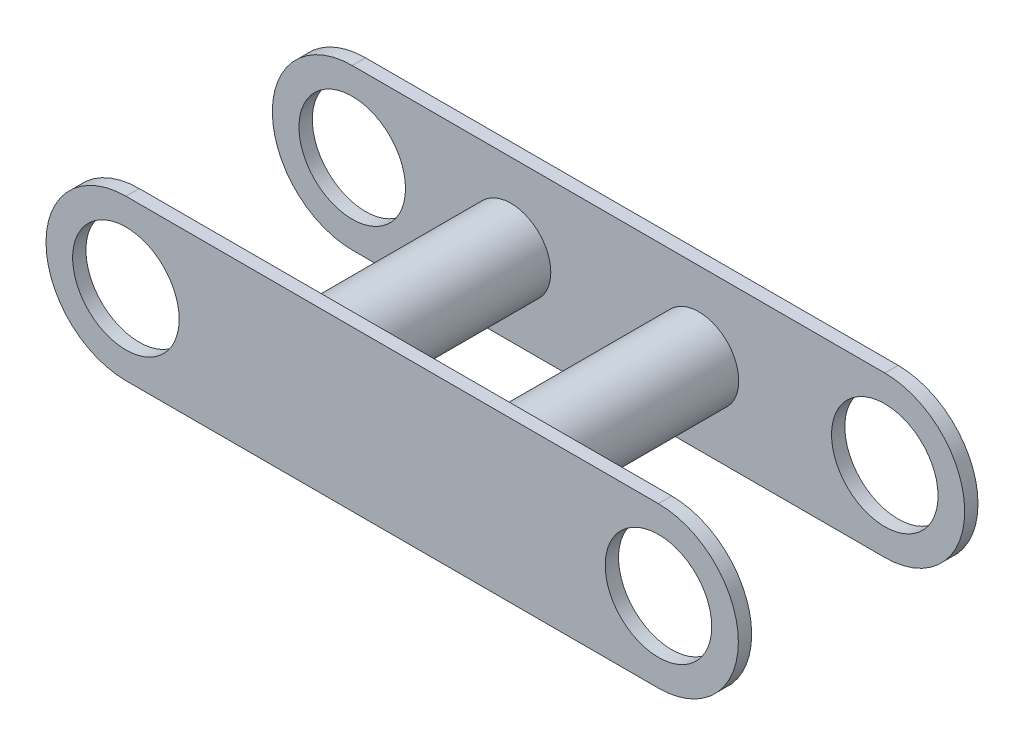
ISO-10303-21;
HEADER;
FILE_DESCRIPTION(('STEP AP214'),'2;1');
FILE_NAME('part.step','',(''),(''),'','','');
FILE_SCHEMA(('AUTOMOTIVE_DESIGN { 1 0 10303 214 1 1 1 1 }'));
ENDSEC;
DATA;
#1=APPLICATION_CONTEXT('core data for automotive mechanical design processes');
#2=APPLICATION_PROTOCOL_DEFINITION('international standard','automotive_design',2000,#1);
#3=PRODUCT_CONTEXT('',#1,'mechanical');
#4=PRODUCT('Part','Part','',(#3));
#5=PRODUCT_RELATED_PRODUCT_CATEGORY('part','',(#4));
#6=PRODUCT_DEFINITION_FORMATION('','',#4);
#7=PRODUCT_DEFINITION_CONTEXT('part definition',#1,'design');
#8=PRODUCT_DEFINITION('design','',#6,#7);
#9=PRODUCT_DEFINITION_SHAPE('','',#8);
#10=(LENGTH_UNIT() NAMED_UNIT(*) SI_UNIT(.MILLI.,.METRE.));
#11=(NAMED_UNIT(*) PLANE_ANGLE_UNIT() SI_UNIT($,.RADIAN.));
#12=(NAMED_UNIT(*) SI_UNIT($,.STERADIAN.) SOLID_ANGLE_UNIT());
#13=UNCERTAINTY_MEASURE_WITH_UNIT(LENGTH_MEASURE(1.E-05),#10,'distance_accuracy_value','');
#14=(GEOMETRIC_REPRESENTATION_CONTEXT(3) GLOBAL_UNCERTAINTY_ASSIGNED_CONTEXT((#13)) GLOBAL_UNIT_ASSIGNED_CONTEXT((#10,
#11,#12)) REPRESENTATION_CONTEXT('',''));
#15=CARTESIAN_POINT('',(0.,0.,0.));
#16=DIRECTION('',(0.,0.,1.));
#17=DIRECTION('',(1.,0.,0.));
#18=AXIS2_PLACEMENT_3D('',#15,#16,#17);
#19=CARTESIAN_POINT('',(-21.5943396226415,0.,5.));
#20=DIRECTION('',(0.,0.,1.));
#21=DIRECTION('',(1.,0.,0.));
#22=AXIS2_PLACEMENT_3D('',#19,#20,#21);
#23=PLANE('',#22);
#24=CARTESIAN_POINT('',(108.550446531279,0.,5.));
#25=DIRECTION('',(0.,0.,1.));
#26=DIRECTION('',(1.,0.,0.));
#27=AXIS2_PLACEMENT_3D('',#24,#25,#26);
#28=CIRCLE('',#27,15.);
#29=CARTESIAN_POINT('',(123.550446531279,0.,5.));
#30=VERTEX_POINT('',#29);
#31=EDGE_CURVE('E143',#30,#30,#28,.T.);
#32=ORIENTED_EDGE('',*,*,#31,.F.);
#33=EDGE_LOOP('',(#32));
#34=FACE_BOUND('',#33,.T.);
#35=CARTESIAN_POINT('',(37.97193523677,0.,5.));
#36=DIRECTION('',(0.,0.,1.));
#37=DIRECTION('',(1.,0.,0.));
#38=AXIS2_PLACEMENT_3D('',#35,#36,#37);
#39=CIRCLE('',#38,15.);
#40=CARTESIAN_POINT('',(52.97193523677,0.,5.));
#41=VERTEX_POINT('',#40);
#42=EDGE_CURVE('E150',#41,#41,#39,.T.);
#43=ORIENTED_EDGE('',*,*,#42,.F.);
#44=EDGE_LOOP('',(#43));
#45=FACE_BOUND('',#44,.T.);
#46=CARTESIAN_POINT('',(178.405660377358,0.,5.));
#47=DIRECTION('',(0.,0.,1.));
#48=DIRECTION('',(1.,0.,0.));
#49=AXIS2_PLACEMENT_3D('',#46,#47,#48);
#50=CIRCLE('',#49,20.);
#51=CARTESIAN_POINT('',(198.405660377358,0.,5.));
#52=VERTEX_POINT('',#51);
#53=EDGE_CURVE('E164',#52,#52,#50,.T.);
#54=ORIENTED_EDGE('',*,*,#53,.F.);
#55=EDGE_LOOP('',(#54));
#56=FACE_BOUND('',#55,.T.);
#57=CARTESIAN_POINT('',(-21.5943396226415,0.,5.));
#58=DIRECTION('',(0.,0.,1.));
#59=DIRECTION('',(1.,0.,0.));
#60=AXIS2_PLACEMENT_3D('',#57,#58,#59);
#61=CIRCLE('',#60,30.);
#62=CARTESIAN_POINT('',(-21.5943396226415,30.,5.));
#63=VERTEX_POINT('',#62);
#64=CARTESIAN_POINT('',(-21.5943396226415,-30.,5.));
#65=VERTEX_POINT('',#64);
#66=EDGE_CURVE('E170',#63,#65,#61,.T.);
#67=ORIENTED_EDGE('',*,*,#66,.T.);
#68=DIRECTION('',(1.,0.,0.));
#69=VECTOR('',#68,1.);
#70=CARTESIAN_POINT('',(-21.5943396226415,-30.,5.));
#71=LINE('',#70,#69);
#72=CARTESIAN_POINT('',(178.405660377358,-30.,5.));
#73=VERTEX_POINT('',#72);
#74=EDGE_CURVE('E87',#65,#73,#71,.T.);
#75=ORIENTED_EDGE('',*,*,#74,.T.);
#76=CARTESIAN_POINT('',(178.405660377358,0.,5.));
#77=DIRECTION('',(0.,0.,1.));
#78=DIRECTION('',(1.,0.,0.));
#79=AXIS2_PLACEMENT_3D('',#76,#77,#78);
#80=CIRCLE('',#79,30.);
#81=CARTESIAN_POINT('',(178.405660377358,30.,5.));
#82=VERTEX_POINT('',#81);
#83=EDGE_CURVE('E173',#73,#82,#80,.T.);
#84=ORIENTED_EDGE('',*,*,#83,.T.);
#85=DIRECTION('',(-1.,0.,0.));
#86=VECTOR('',#85,1.);
#87=CARTESIAN_POINT('',(-21.5943396226415,30.,5.));
#88=LINE('',#87,#86);
#89=EDGE_CURVE('E56',#82,#63,#88,.T.);
#90=ORIENTED_EDGE('',*,*,#89,.T.);
#91=EDGE_LOOP('',(#67,#75,#84,#90));
#92=FACE_BOUND('',#91,.T.);
#93=CARTESIAN_POINT('',(-21.5943396226415,0.,5.));
#94=DIRECTION('',(0.,0.,1.));
#95=DIRECTION('',(1.,0.,0.));
#96=AXIS2_PLACEMENT_3D('',#93,#94,#95);
#97=CIRCLE('',#96,20.);
#98=CARTESIAN_POINT('',(-1.59433962264151,0.,5.));
#99=VERTEX_POINT('',#98);
#100=EDGE_CURVE('E158',#99,#99,#97,.T.);
#101=ORIENTED_EDGE('',*,*,#100,.F.);
#102=EDGE_LOOP('',(#101));
#103=FACE_BOUND('',#102,.T.);
#104=ADVANCED_FACE('F39',(#34,#45,#56,#92,#103),#23,.T.);
#105=CARTESIAN_POINT('',(-21.5943396226415,0.,0.));
#106=DIRECTION('',(0.,0.,1.));
#107=DIRECTION('',(1.,0.,0.));
#108=AXIS2_PLACEMENT_3D('',#105,#106,#107);
#109=PLANE('',#108);
#110=CARTESIAN_POINT('',(-21.5943396226415,0.,0.));
#111=DIRECTION('',(0.,0.,1.));
#112=DIRECTION('',(1.,0.,0.));
#113=AXIS2_PLACEMENT_3D('',#110,#111,#112);
#114=CIRCLE('',#113,30.);
#115=CARTESIAN_POINT('',(-21.5943396226415,30.,0.));
#116=VERTEX_POINT('',#115);
#117=CARTESIAN_POINT('',(-21.5943396226415,-30.,0.));
#118=VERTEX_POINT('',#117);
#119=EDGE_CURVE('E167',#116,#118,#114,.T.);
#120=ORIENTED_EDGE('',*,*,#119,.F.);
#121=DIRECTION('',(-1.,0.,0.));
#122=VECTOR('',#121,1.);
#123=CARTESIAN_POINT('',(-21.5943396226415,30.,0.));
#124=LINE('',#123,#122);
#125=CARTESIAN_POINT('',(178.405660377358,30.,0.));
#126=VERTEX_POINT('',#125);
#127=EDGE_CURVE('E80',#126,#116,#124,.T.);
#128=ORIENTED_EDGE('',*,*,#127,.F.);
#129=CARTESIAN_POINT('',(178.405660377358,0.,0.));
#130=DIRECTION('',(0.,0.,1.));
#131=DIRECTION('',(1.,0.,0.));
#132=AXIS2_PLACEMENT_3D('',#129,#130,#131);
#133=CIRCLE('',#132,30.);
#134=CARTESIAN_POINT('',(178.405660377358,-30.,0.));
#135=VERTEX_POINT('',#134);
#136=EDGE_CURVE('E74',#135,#126,#133,.T.);
#137=ORIENTED_EDGE('',*,*,#136,.F.);
#138=DIRECTION('',(1.,0.,0.));
#139=VECTOR('',#138,1.);
#140=CARTESIAN_POINT('',(-21.5943396226415,-30.,0.));
#141=LINE('',#140,#139);
#142=EDGE_CURVE('E179',#118,#135,#141,.T.);
#143=ORIENTED_EDGE('',*,*,#142,.F.);
#144=EDGE_LOOP('',(#120,#128,#137,#143));
#145=FACE_BOUND('',#144,.T.);
#146=CARTESIAN_POINT('',(178.405660377358,0.,0.));
#147=DIRECTION('',(0.,0.,1.));
#148=DIRECTION('',(1.,0.,0.));
#149=AXIS2_PLACEMENT_3D('',#146,#147,#148);
#150=CIRCLE('',#149,20.);
#151=CARTESIAN_POINT('',(198.405660377358,0.,0.));
#152=VERTEX_POINT('',#151);
#153=EDGE_CURVE('E161',#152,#152,#150,.T.);
#154=ORIENTED_EDGE('',*,*,#153,.T.);
#155=EDGE_LOOP('',(#154));
#156=FACE_BOUND('',#155,.T.);
#157=CARTESIAN_POINT('',(-21.5943396226415,0.,0.));
#158=DIRECTION('',(0.,0.,1.));
#159=DIRECTION('',(1.,0.,0.));
#160=AXIS2_PLACEMENT_3D('',#157,#158,#159);
#161=CIRCLE('',#160,20.);
#162=CARTESIAN_POINT('',(-1.59433962264151,0.,0.));
#163=VERTEX_POINT('',#162);
#164=EDGE_CURVE('E155',#163,#163,#161,.T.);
#165=ORIENTED_EDGE('',*,*,#164,.T.);
#166=EDGE_LOOP('',(#165));
#167=FACE_BOUND('',#166,.T.);
#168=ADVANCED_FACE('F189',(#145,#156,#167),#109,.F.);
#169=CARTESIAN_POINT('',(-21.5943396226415,0.,5.));
#170=DIRECTION('',(0.,0.,-1.));
#171=DIRECTION('',(-1.,0.,0.));
#172=AXIS2_PLACEMENT_3D('',#169,#170,#171);
#173=CYLINDRICAL_SURFACE('',#172,30.);
#174=ORIENTED_EDGE('',*,*,#119,.T.);
#175=DIRECTION('',(0.,0.,-1.));
#176=VECTOR('',#175,1.);
#177=CARTESIAN_POINT('',(-21.5943396226415,-30.,5.));
#178=LINE('',#177,#176);
#179=EDGE_CURVE('E11',#65,#118,#178,.T.);
#180=ORIENTED_EDGE('',*,*,#179,.F.);
#181=ORIENTED_EDGE('',*,*,#66,.F.);
#182=DIRECTION('',(0.,0.,-1.));
#183=VECTOR('',#182,1.);
#184=CARTESIAN_POINT('',(-21.5943396226415,30.,5.));
#185=LINE('',#184,#183);
#186=EDGE_CURVE('E176',#63,#116,#185,.T.);
#187=ORIENTED_EDGE('',*,*,#186,.T.);
#188=EDGE_LOOP('',(#174,#180,#181,#187));
#189=FACE_BOUND('',#188,.T.);
#190=ADVANCED_FACE('F41',(#189),#173,.T.);
#191=CARTESIAN_POINT('',(-21.5943396226415,-30.,5.));
#192=DIRECTION('',(0.,1.,0.));
#193=DIRECTION('',(-1.,0.,0.));
#194=AXIS2_PLACEMENT_3D('',#191,#192,#193);
#195=PLANE('',#194);
#196=ORIENTED_EDGE('',*,*,#142,.T.);
#197=DIRECTION('',(0.,0.,-1.));
#198=VECTOR('',#197,1.);
#199=CARTESIAN_POINT('',(178.405660377358,-30.,5.));
#200=LINE('',#199,#198);
#201=EDGE_CURVE('E48',#73,#135,#200,.T.);
#202=ORIENTED_EDGE('',*,*,#201,.F.);
#203=ORIENTED_EDGE('',*,*,#74,.F.);
#204=ORIENTED_EDGE('',*,*,#179,.T.);
#205=EDGE_LOOP('',(#196,#202,#203,#204));
#206=FACE_BOUND('',#205,.T.);
#207=ADVANCED_FACE('F205',(#206),#195,.F.);
#208=CARTESIAN_POINT('',(178.405660377358,0.,5.));
#209=DIRECTION('',(0.,0.,-1.));
#210=DIRECTION('',(-1.,0.,0.));
#211=AXIS2_PLACEMENT_3D('',#208,#209,#210);
#212=CYLINDRICAL_SURFACE('',#211,30.);
#213=ORIENTED_EDGE('',*,*,#136,.T.);
#214=DIRECTION('',(0.,0.,-1.));
#215=VECTOR('',#214,1.);
#216=CARTESIAN_POINT('',(178.405660377358,30.,5.));
#217=LINE('',#216,#215);
#218=EDGE_CURVE('E184',#82,#126,#217,.T.);
#219=ORIENTED_EDGE('',*,*,#218,.F.);
#220=ORIENTED_EDGE('',*,*,#83,.F.);
#221=ORIENTED_EDGE('',*,*,#201,.T.);
#222=EDGE_LOOP('',(#213,#219,#220,#221));
#223=FACE_BOUND('',#222,.T.);
#224=ADVANCED_FACE('F186',(#223),#212,.T.);
#225=CARTESIAN_POINT('',(-21.5943396226415,30.,5.));
#226=DIRECTION('',(0.,-1.,0.));
#227=DIRECTION('',(1.,0.,0.));
#228=AXIS2_PLACEMENT_3D('',#225,#226,#227);
#229=PLANE('',#228);
#230=ORIENTED_EDGE('',*,*,#127,.T.);
#231=ORIENTED_EDGE('',*,*,#186,.F.);
#232=ORIENTED_EDGE('',*,*,#89,.F.);
#233=ORIENTED_EDGE('',*,*,#218,.T.);
#234=EDGE_LOOP('',(#230,#231,#232,#233));
#235=FACE_BOUND('',#234,.T.);
#236=ADVANCED_FACE('F194',(#235),#229,.F.);
#237=CARTESIAN_POINT('',(178.405660377358,0.,5.));
#238=DIRECTION('',(0.,0.,-1.));
#239=DIRECTION('',(-1.,0.,0.));
#240=AXIS2_PLACEMENT_3D('',#237,#238,#239);
#241=CYLINDRICAL_SURFACE('',#240,20.);
#242=ORIENTED_EDGE('',*,*,#53,.T.);
#243=EDGE_LOOP('',(#242));
#244=FACE_BOUND('',#243,.T.);
#245=ORIENTED_EDGE('',*,*,#153,.F.);
#246=EDGE_LOOP('',(#245));
#247=FACE_BOUND('',#246,.T.);
#248=ADVANCED_FACE('F196',(#244,#247),#241,.F.);
#249=CARTESIAN_POINT('',(-21.5943396226415,0.,5.));
#250=DIRECTION('',(0.,0.,-1.));
#251=DIRECTION('',(-1.,0.,0.));
#252=AXIS2_PLACEMENT_3D('',#249,#250,#251);
#253=CYLINDRICAL_SURFACE('',#252,20.);
#254=ORIENTED_EDGE('',*,*,#100,.T.);
#255=EDGE_LOOP('',(#254));
#256=FACE_BOUND('',#255,.T.);
#257=ORIENTED_EDGE('',*,*,#164,.F.);
#258=EDGE_LOOP('',(#257));
#259=FACE_BOUND('',#258,.T.);
#260=ADVANCED_FACE('F202',(#256,#259),#253,.F.);
#261=CARTESIAN_POINT('',(37.97193523677,0.,85.));
#262=DIRECTION('',(0.,0.,-1.));
#263=DIRECTION('',(-1.,0.,0.));
#264=AXIS2_PLACEMENT_3D('',#261,#262,#263);
#265=CYLINDRICAL_SURFACE('',#264,15.);
#266=CARTESIAN_POINT('',(37.97193523677,0.,85.));
#267=DIRECTION('',(0.,0.,1.));
#268=DIRECTION('',(1.,0.,0.));
#269=AXIS2_PLACEMENT_3D('',#266,#267,#268);
#270=CIRCLE('',#269,15.);
#271=CARTESIAN_POINT('',(52.97193523677,0.,85.));
#272=VERTEX_POINT('',#271);
#273=EDGE_CURVE('E152',#272,#272,#270,.T.);
#274=ORIENTED_EDGE('',*,*,#273,.F.);
#275=EDGE_LOOP('',(#274));
#276=FACE_BOUND('',#275,.T.);
#277=ORIENTED_EDGE('',*,*,#42,.T.);
#278=EDGE_LOOP('',(#277));
#279=FACE_BOUND('',#278,.T.);
#280=ADVANCED_FACE('F220',(#276,#279),#265,.T.);
#281=CARTESIAN_POINT('',(108.550446531279,0.,85.));
#282=DIRECTION('',(0.,0.,-1.));
#283=DIRECTION('',(-1.,0.,0.));
#284=AXIS2_PLACEMENT_3D('',#281,#282,#283);
#285=CYLINDRICAL_SURFACE('',#284,15.);
#286=CARTESIAN_POINT('',(108.550446531279,0.,85.));
#287=DIRECTION('',(0.,0.,1.));
#288=DIRECTION('',(1.,0.,0.));
#289=AXIS2_PLACEMENT_3D('',#286,#287,#288);
#290=CIRCLE('',#289,15.);
#291=CARTESIAN_POINT('',(123.550446531279,0.,85.));
#292=VERTEX_POINT('',#291);
#293=EDGE_CURVE('E140',#292,#292,#290,.T.);
#294=ORIENTED_EDGE('',*,*,#293,.F.);
#295=EDGE_LOOP('',(#294));
#296=FACE_BOUND('',#295,.T.);
#297=ORIENTED_EDGE('',*,*,#31,.T.);
#298=EDGE_LOOP('',(#297));
#299=FACE_BOUND('',#298,.T.);
#300=ADVANCED_FACE('F223',(#296,#299),#285,.T.);
#301=CARTESIAN_POINT('',(-21.5943396226415,0.,90.));
#302=DIRECTION('',(0.,0.,1.));
#303=DIRECTION('',(1.,0.,0.));
#304=AXIS2_PLACEMENT_3D('',#301,#302,#303);
#305=PLANE('',#304);
#306=CARTESIAN_POINT('',(178.405660377358,0.,90.));
#307=DIRECTION('',(0.,0.,1.));
#308=DIRECTION('',(1.,0.,0.));
#309=AXIS2_PLACEMENT_3D('',#306,#307,#308);
#310=CIRCLE('',#309,20.);
#311=CARTESIAN_POINT('',(198.405660377358,0.,90.));
#312=VERTEX_POINT('',#311);
#313=EDGE_CURVE('E268',#312,#312,#310,.T.);
#314=ORIENTED_EDGE('',*,*,#313,.F.);
#315=EDGE_LOOP('',(#314));
#316=FACE_BOUND('',#315,.T.);
#317=CARTESIAN_POINT('',(-21.5943396226415,0.,90.));
#318=DIRECTION('',(0.,0.,1.));
#319=DIRECTION('',(1.,0.,0.));
#320=AXIS2_PLACEMENT_3D('',#317,#318,#319);
#321=CIRCLE('',#320,30.);
#322=CARTESIAN_POINT('',(-21.5943396226415,30.,90.));
#323=VERTEX_POINT('',#322);
#324=CARTESIAN_POINT('',(-21.5943396226415,-30.,90.));
#325=VERTEX_POINT('',#324);
#326=EDGE_CURVE('E125',#323,#325,#321,.T.);
#327=ORIENTED_EDGE('',*,*,#326,.T.);
#328=DIRECTION('',(1.,0.,0.));
#329=VECTOR('',#328,1.);
#330=CARTESIAN_POINT('',(-21.5943396226415,-30.,90.));
#331=LINE('',#330,#329);
#332=CARTESIAN_POINT('',(178.405660377358,-30.,90.));
#333=VERTEX_POINT('',#332);
#334=EDGE_CURVE('E114',#325,#333,#331,.T.);
#335=ORIENTED_EDGE('',*,*,#334,.T.);
#336=CARTESIAN_POINT('',(178.405660377358,0.,90.));
#337=DIRECTION('',(0.,0.,1.));
#338=DIRECTION('',(1.,0.,0.));
#339=AXIS2_PLACEMENT_3D('',#336,#337,#338);
#340=CIRCLE('',#339,30.);
#341=CARTESIAN_POINT('',(178.405660377358,30.,90.));
#342=VERTEX_POINT('',#341);
#343=EDGE_CURVE('E124',#333,#342,#340,.T.);
#344=ORIENTED_EDGE('',*,*,#343,.T.);
#345=DIRECTION('',(-1.,0.,0.));
#346=VECTOR('',#345,1.);
#347=CARTESIAN_POINT('',(-21.5943396226415,30.,90.));
#348=LINE('',#347,#346);
#349=EDGE_CURVE('E131',#342,#323,#348,.T.);
#350=ORIENTED_EDGE('',*,*,#349,.T.);
#351=EDGE_LOOP('',(#327,#335,#344,#350));
#352=FACE_BOUND('',#351,.T.);
#353=CARTESIAN_POINT('',(-21.5943396226415,0.,90.));
#354=DIRECTION('',(0.,0.,1.));
#355=DIRECTION('',(1.,0.,0.));
#356=AXIS2_PLACEMENT_3D('',#353,#354,#355);
#357=CIRCLE('',#356,20.);
#358=CARTESIAN_POINT('',(-1.59433962264151,0.,90.));
#359=VERTEX_POINT('',#358);
#360=EDGE_CURVE('E259',#359,#359,#357,.T.);
#361=ORIENTED_EDGE('',*,*,#360,.F.);
#362=EDGE_LOOP('',(#361));
#363=FACE_BOUND('',#362,.T.);
#364=ADVANCED_FACE('F128',(#316,#352,#363),#305,.T.);
#365=CARTESIAN_POINT('',(-21.5943396226415,0.,85.));
#366=DIRECTION('',(0.,0.,1.));
#367=DIRECTION('',(1.,0.,0.));
#368=AXIS2_PLACEMENT_3D('',#365,#366,#367);
#369=PLANE('',#368);
#370=ORIENTED_EDGE('',*,*,#273,.T.);
#371=EDGE_LOOP('',(#370));
#372=FACE_BOUND('',#371,.T.);
#373=ORIENTED_EDGE('',*,*,#293,.T.);
#374=EDGE_LOOP('',(#373));
#375=FACE_BOUND('',#374,.T.);
#376=CARTESIAN_POINT('',(-21.5943396226415,0.,85.));
#377=DIRECTION('',(0.,0.,1.));
#378=DIRECTION('',(1.,0.,0.));
#379=AXIS2_PLACEMENT_3D('',#376,#377,#378);
#380=CIRCLE('',#379,30.);
#381=CARTESIAN_POINT('',(-21.5943396226415,30.,85.));
#382=VERTEX_POINT('',#381);
#383=CARTESIAN_POINT('',(-21.5943396226415,-30.,85.));
#384=VERTEX_POINT('',#383);
#385=EDGE_CURVE('E139',#382,#384,#380,.T.);
#386=ORIENTED_EDGE('',*,*,#385,.F.);
#387=DIRECTION('',(-1.,0.,0.));
#388=VECTOR('',#387,1.);
#389=CARTESIAN_POINT('',(-21.5943396226415,30.,85.));
#390=LINE('',#389,#388);
#391=CARTESIAN_POINT('',(178.405660377358,30.,85.));
#392=VERTEX_POINT('',#391);
#393=EDGE_CURVE('E135',#392,#382,#390,.T.);
#394=ORIENTED_EDGE('',*,*,#393,.F.);
#395=CARTESIAN_POINT('',(178.405660377358,0.,85.));
#396=DIRECTION('',(0.,0.,1.));
#397=DIRECTION('',(1.,0.,0.));
#398=AXIS2_PLACEMENT_3D('',#395,#396,#397);
#399=CIRCLE('',#398,30.);
#400=CARTESIAN_POINT('',(178.405660377358,-30.,85.));
#401=VERTEX_POINT('',#400);
#402=EDGE_CURVE('E279',#401,#392,#399,.T.);
#403=ORIENTED_EDGE('',*,*,#402,.F.);
#404=DIRECTION('',(1.,0.,0.));
#405=VECTOR('',#404,1.);
#406=CARTESIAN_POINT('',(-21.5943396226415,-30.,85.));
#407=LINE('',#406,#405);
#408=EDGE_CURVE('E277',#384,#401,#407,.T.);
#409=ORIENTED_EDGE('',*,*,#408,.F.);
#410=EDGE_LOOP('',(#386,#394,#403,#409));
#411=FACE_BOUND('',#410,.T.);
#412=CARTESIAN_POINT('',(178.405660377358,0.,85.));
#413=DIRECTION('',(0.,0.,1.));
#414=DIRECTION('',(1.,0.,0.));
#415=AXIS2_PLACEMENT_3D('',#412,#413,#414);
#416=CIRCLE('',#415,20.);
#417=CARTESIAN_POINT('',(198.405660377358,0.,85.));
#418=VERTEX_POINT('',#417);
#419=EDGE_CURVE('E265',#418,#418,#416,.T.);
#420=ORIENTED_EDGE('',*,*,#419,.T.);
#421=EDGE_LOOP('',(#420));
#422=FACE_BOUND('',#421,.T.);
#423=CARTESIAN_POINT('',(-21.5943396226415,0.,85.));
#424=DIRECTION('',(0.,0.,1.));
#425=DIRECTION('',(1.,0.,0.));
#426=AXIS2_PLACEMENT_3D('',#423,#424,#425);
#427=CIRCLE('',#426,20.);
#428=CARTESIAN_POINT('',(-1.59433962264151,0.,85.));
#429=VERTEX_POINT('',#428);
#430=EDGE_CURVE('E262',#429,#429,#427,.T.);
#431=ORIENTED_EDGE('',*,*,#430,.T.);
#432=EDGE_LOOP('',(#431));
#433=FACE_BOUND('',#432,.T.);
#434=ADVANCED_FACE('F230',(#372,#375,#411,#422,#433),#369,.F.);
#435=CARTESIAN_POINT('',(-21.5943396226415,0.,90.));
#436=DIRECTION('',(0.,0.,-1.));
#437=DIRECTION('',(-1.,0.,0.));
#438=AXIS2_PLACEMENT_3D('',#435,#436,#437);
#439=CYLINDRICAL_SURFACE('',#438,30.);
#440=ORIENTED_EDGE('',*,*,#385,.T.);
#441=DIRECTION('',(0.,0.,-1.));
#442=VECTOR('',#441,1.);
#443=CARTESIAN_POINT('',(-21.5943396226415,-30.,90.));
#444=LINE('',#443,#442);
#445=EDGE_CURVE('E118',#325,#384,#444,.T.);
#446=ORIENTED_EDGE('',*,*,#445,.F.);
#447=ORIENTED_EDGE('',*,*,#326,.F.);
#448=DIRECTION('',(0.,0.,-1.));
#449=VECTOR('',#448,1.);
#450=CARTESIAN_POINT('',(-21.5943396226415,30.,90.));
#451=LINE('',#450,#449);
#452=EDGE_CURVE('E275',#323,#382,#451,.T.);
#453=ORIENTED_EDGE('',*,*,#452,.T.);
#454=EDGE_LOOP('',(#440,#446,#447,#453));
#455=FACE_BOUND('',#454,.T.);
#456=ADVANCED_FACE('F137',(#455),#439,.T.);
#457=CARTESIAN_POINT('',(-21.5943396226415,-30.,90.));
#458=DIRECTION('',(0.,1.,0.));
#459=DIRECTION('',(-1.,0.,0.));
#460=AXIS2_PLACEMENT_3D('',#457,#458,#459);
#461=PLANE('',#460);
#462=ORIENTED_EDGE('',*,*,#408,.T.);
#463=DIRECTION('',(0.,0.,-1.));
#464=VECTOR('',#463,1.);
#465=CARTESIAN_POINT('',(178.405660377358,-30.,90.));
#466=LINE('',#465,#464);
#467=EDGE_CURVE('E121',#333,#401,#466,.T.);
#468=ORIENTED_EDGE('',*,*,#467,.F.);
#469=ORIENTED_EDGE('',*,*,#334,.F.);
#470=ORIENTED_EDGE('',*,*,#445,.T.);
#471=EDGE_LOOP('',(#462,#468,#469,#470));
#472=FACE_BOUND('',#471,.T.);
#473=ADVANCED_FACE('F116',(#472),#461,.F.);
#474=CARTESIAN_POINT('',(178.405660377358,0.,90.));
#475=DIRECTION('',(0.,0.,-1.));
#476=DIRECTION('',(-1.,0.,0.));
#477=AXIS2_PLACEMENT_3D('',#474,#475,#476);
#478=CYLINDRICAL_SURFACE('',#477,30.);
#479=ORIENTED_EDGE('',*,*,#402,.T.);
#480=DIRECTION('',(0.,0.,-1.));
#481=VECTOR('',#480,1.);
#482=CARTESIAN_POINT('',(178.405660377358,30.,90.));
#483=LINE('',#482,#481);
#484=EDGE_CURVE('E145',#342,#392,#483,.T.);
#485=ORIENTED_EDGE('',*,*,#484,.F.);
#486=ORIENTED_EDGE('',*,*,#343,.F.);
#487=ORIENTED_EDGE('',*,*,#467,.T.);
#488=EDGE_LOOP('',(#479,#485,#486,#487));
#489=FACE_BOUND('',#488,.T.);
#490=ADVANCED_FACE('F233',(#489),#478,.T.);
#491=CARTESIAN_POINT('',(-21.5943396226415,30.,90.));
#492=DIRECTION('',(0.,-1.,0.));
#493=DIRECTION('',(1.,0.,0.));
#494=AXIS2_PLACEMENT_3D('',#491,#492,#493);
#495=PLANE('',#494);
#496=ORIENTED_EDGE('',*,*,#393,.T.);
#497=ORIENTED_EDGE('',*,*,#452,.F.);
#498=ORIENTED_EDGE('',*,*,#349,.F.);
#499=ORIENTED_EDGE('',*,*,#484,.T.);
#500=EDGE_LOOP('',(#496,#497,#498,#499));
#501=FACE_BOUND('',#500,.T.);
#502=ADVANCED_FACE('F236',(#501),#495,.F.);
#503=CARTESIAN_POINT('',(178.405660377358,0.,90.));
#504=DIRECTION('',(0.,0.,-1.));
#505=DIRECTION('',(-1.,0.,0.));
#506=AXIS2_PLACEMENT_3D('',#503,#504,#505);
#507=CYLINDRICAL_SURFACE('',#506,20.);
#508=ORIENTED_EDGE('',*,*,#313,.T.);
#509=EDGE_LOOP('',(#508));
#510=FACE_BOUND('',#509,.T.);
#511=ORIENTED_EDGE('',*,*,#419,.F.);
#512=EDGE_LOOP('',(#511));
#513=FACE_BOUND('',#512,.T.);
#514=ADVANCED_FACE('F240',(#510,#513),#507,.F.);
#515=CARTESIAN_POINT('',(-21.5943396226415,0.,90.));
#516=DIRECTION('',(0.,0.,-1.));
#517=DIRECTION('',(-1.,0.,0.));
#518=AXIS2_PLACEMENT_3D('',#515,#516,#517);
#519=CYLINDRICAL_SURFACE('',#518,20.);
#520=ORIENTED_EDGE('',*,*,#360,.T.);
#521=EDGE_LOOP('',(#520));
#522=FACE_BOUND('',#521,.T.);
#523=ORIENTED_EDGE('',*,*,#430,.F.);
#524=EDGE_LOOP('',(#523));
#525=FACE_BOUND('',#524,.T.);
#526=ADVANCED_FACE('F250',(#522,#525),#519,.F.);
#527=CLOSED_SHELL('',(#104,#168,#190,#207,#224,#236,#248,#260,#280,#300,#364,#434,#456,#473,
#490,#502,#514,#526));
#528=MANIFOLD_SOLID_BREP('B2',#527);
#529=ADVANCED_BREP_SHAPE_REPRESENTATION('',(#18,#528),#14);
#530=SHAPE_DEFINITION_REPRESENTATION(#9,#529);
ENDSEC;
END-ISO-10303-21;
